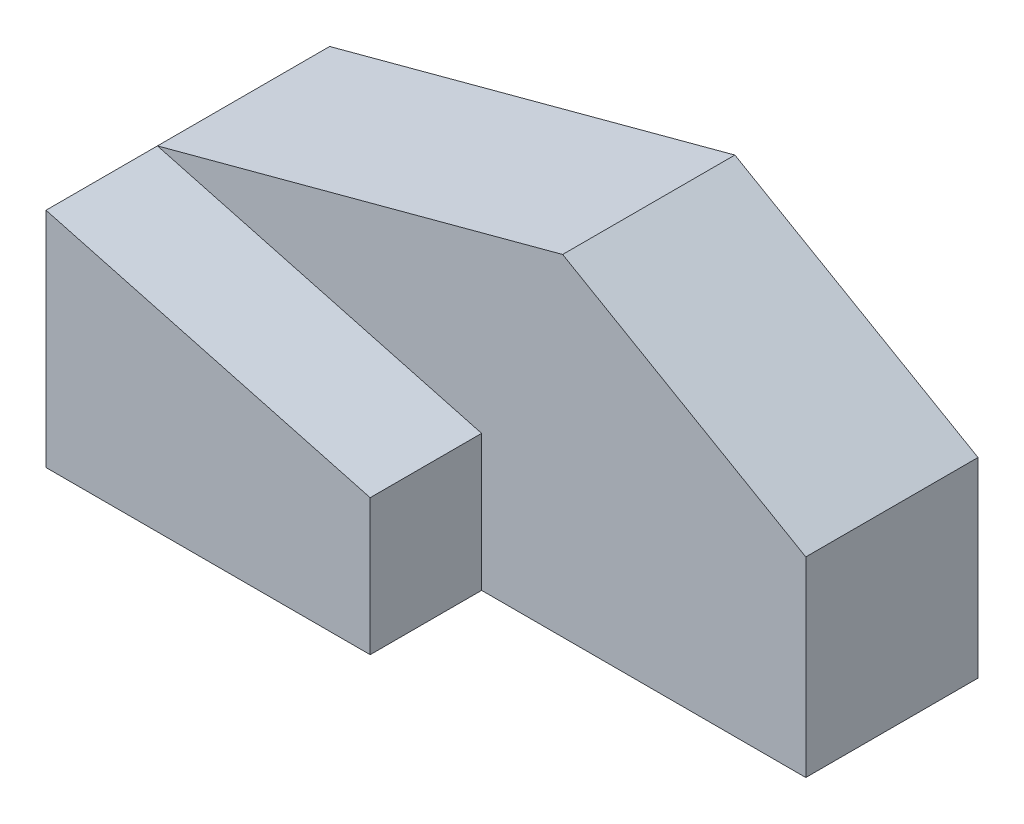
ISO-10303-21;
HEADER;
FILE_DESCRIPTION(('STEP AP214'),'2;1');
FILE_NAME('part.step','',(''),(''),'','','');
FILE_SCHEMA(('AUTOMOTIVE_DESIGN { 1 0 10303 214 1 1 1 1 }'));
ENDSEC;
DATA;
#1=APPLICATION_CONTEXT('core data for automotive mechanical design processes');
#2=APPLICATION_PROTOCOL_DEFINITION('international standard','automotive_design',2000,#1);
#3=PRODUCT_CONTEXT('',#1,'mechanical');
#4=PRODUCT('Part','Part','',(#3));
#5=PRODUCT_RELATED_PRODUCT_CATEGORY('part','',(#4));
#6=PRODUCT_DEFINITION_FORMATION('','',#4);
#7=PRODUCT_DEFINITION_CONTEXT('part definition',#1,'design');
#8=PRODUCT_DEFINITION('design','',#6,#7);
#9=PRODUCT_DEFINITION_SHAPE('','',#8);
#10=(LENGTH_UNIT() NAMED_UNIT(*) SI_UNIT(.MILLI.,.METRE.));
#11=(NAMED_UNIT(*) PLANE_ANGLE_UNIT() SI_UNIT($,.RADIAN.));
#12=(NAMED_UNIT(*) SI_UNIT($,.STERADIAN.) SOLID_ANGLE_UNIT());
#13=UNCERTAINTY_MEASURE_WITH_UNIT(LENGTH_MEASURE(1.E-05),#10,'distance_accuracy_value','');
#14=(GEOMETRIC_REPRESENTATION_CONTEXT(3) GLOBAL_UNCERTAINTY_ASSIGNED_CONTEXT((#13)) GLOBAL_UNIT_ASSIGNED_CONTEXT((#10,
#11,#12)) REPRESENTATION_CONTEXT('',''));
#15=CARTESIAN_POINT('',(0.,0.,0.));
#16=DIRECTION('',(0.,0.,1.));
#17=DIRECTION('',(1.,0.,0.));
#18=AXIS2_PLACEMENT_3D('',#15,#16,#17);
#19=CARTESIAN_POINT('',(0.,22.,-17.));
#20=DIRECTION('',(-1.,0.,0.));
#21=DIRECTION('',(0.,-1.,0.));
#22=AXIS2_PLACEMENT_3D('',#19,#20,#21);
#23=PLANE('',#22);
#24=DIRECTION('',(0.,0.,1.));
#25=VECTOR('',#24,1.);
#26=CARTESIAN_POINT('',(0.,0.,-17.));
#27=LINE('',#26,#25);
#28=CARTESIAN_POINT('',(0.,0.,-17.));
#29=VERTEX_POINT('',#28);
#30=CARTESIAN_POINT('',(0.,0.,11.));
#31=VERTEX_POINT('',#30);
#32=EDGE_CURVE('E82',#29,#31,#27,.T.);
#33=ORIENTED_EDGE('',*,*,#32,.T.);
#34=DIRECTION('',(0.,-1.,0.));
#35=VECTOR('',#34,1.);
#36=CARTESIAN_POINT('',(0.,22.,11.));
#37=LINE('',#36,#35);
#38=CARTESIAN_POINT('',(0.,22.,11.));
#39=VERTEX_POINT('',#38);
#40=EDGE_CURVE('E155',#39,#31,#37,.T.);
#41=ORIENTED_EDGE('',*,*,#40,.F.);
#42=DIRECTION('',(0.,0.,-1.));
#43=VECTOR('',#42,1.);
#44=CARTESIAN_POINT('',(0.,22.,11.));
#45=LINE('',#44,#43);
#46=CARTESIAN_POINT('',(0.,22.,0.));
#47=VERTEX_POINT('',#46);
#48=EDGE_CURVE('E140',#39,#47,#45,.T.);
#49=ORIENTED_EDGE('',*,*,#48,.T.);
#50=DIRECTION('',(0.,0.,1.));
#51=VECTOR('',#50,1.);
#52=CARTESIAN_POINT('',(0.,22.,-17.));
#53=LINE('',#52,#51);
#54=CARTESIAN_POINT('',(0.,22.,-17.));
#55=VERTEX_POINT('',#54);
#56=EDGE_CURVE('E11',#55,#47,#53,.T.);
#57=ORIENTED_EDGE('',*,*,#56,.F.);
#58=DIRECTION('',(0.,-1.,0.));
#59=VECTOR('',#58,1.);
#60=CARTESIAN_POINT('',(0.,22.,-17.));
#61=LINE('',#60,#59);
#62=EDGE_CURVE('E116',#55,#29,#61,.T.);
#63=ORIENTED_EDGE('',*,*,#62,.T.);
#64=EDGE_LOOP('',(#33,#41,#49,#57,#63));
#65=FACE_BOUND('',#64,.T.);
#66=ADVANCED_FACE('F31',(#65),#23,.T.);
#67=CARTESIAN_POINT('',(40.,32.7179676972448,-17.));
#68=DIRECTION('',(-0.258819045102518,0.965925826289069,0.));
#69=DIRECTION('',(-0.965925826289069,-0.258819045102518,0.));
#70=AXIS2_PLACEMENT_3D('',#67,#68,#69);
#71=PLANE('',#70);
#72=DIRECTION('',(-0.965925826289069,-0.258819045102518,0.));
#73=VECTOR('',#72,1.);
#74=CARTESIAN_POINT('',(40.,32.7179676972448,0.));
#75=LINE('',#74,#73);
#76=CARTESIAN_POINT('',(40.,32.7179676972448,0.));
#77=VERTEX_POINT('',#76);
#78=EDGE_CURVE('E149',#77,#47,#75,.T.);
#79=ORIENTED_EDGE('',*,*,#78,.F.);
#80=DIRECTION('',(0.,0.,1.));
#81=VECTOR('',#80,1.);
#82=CARTESIAN_POINT('',(40.,32.7179676972448,-17.));
#83=LINE('',#82,#81);
#84=CARTESIAN_POINT('',(40.,32.7179676972448,-17.));
#85=VERTEX_POINT('',#84);
#86=EDGE_CURVE('E39',#85,#77,#83,.T.);
#87=ORIENTED_EDGE('',*,*,#86,.F.);
#88=DIRECTION('',(-0.965925826289069,-0.258819045102518,0.));
#89=VECTOR('',#88,1.);
#90=CARTESIAN_POINT('',(40.,32.7179676972448,-17.));
#91=LINE('',#90,#89);
#92=EDGE_CURVE('E110',#85,#55,#91,.T.);
#93=ORIENTED_EDGE('',*,*,#92,.T.);
#94=ORIENTED_EDGE('',*,*,#56,.T.);
#95=EDGE_LOOP('',(#79,#87,#93,#94));
#96=FACE_BOUND('',#95,.T.);
#97=ADVANCED_FACE('F187',(#96),#71,.T.);
#98=CARTESIAN_POINT('',(64.,18.8615612366936,-17.));
#99=DIRECTION('',(0.500000000000004,0.866025403784436,0.));
#100=DIRECTION('',(-0.866025403784436,0.500000000000004,0.));
#101=AXIS2_PLACEMENT_3D('',#98,#99,#100);
#102=PLANE('',#101);
#103=DIRECTION('',(-0.866025403784436,0.500000000000004,0.));
#104=VECTOR('',#103,1.);
#105=CARTESIAN_POINT('',(64.,18.8615612366936,0.));
#106=LINE('',#105,#104);
#107=CARTESIAN_POINT('',(64.,18.8615612366936,0.));
#108=VERTEX_POINT('',#107);
#109=EDGE_CURVE('E99',#108,#77,#106,.T.);
#110=ORIENTED_EDGE('',*,*,#109,.F.);
#111=DIRECTION('',(0.,0.,1.));
#112=VECTOR('',#111,1.);
#113=CARTESIAN_POINT('',(64.,18.8615612366936,-17.));
#114=LINE('',#113,#112);
#115=CARTESIAN_POINT('',(64.,18.8615612366936,-17.));
#116=VERTEX_POINT('',#115);
#117=EDGE_CURVE('E93',#116,#108,#114,.T.);
#118=ORIENTED_EDGE('',*,*,#117,.F.);
#119=DIRECTION('',(-0.866025403784436,0.500000000000004,0.));
#120=VECTOR('',#119,1.);
#121=CARTESIAN_POINT('',(64.,18.8615612366936,-17.));
#122=LINE('',#121,#120);
#123=EDGE_CURVE('E96',#116,#85,#122,.T.);
#124=ORIENTED_EDGE('',*,*,#123,.T.);
#125=ORIENTED_EDGE('',*,*,#86,.T.);
#126=EDGE_LOOP('',(#110,#118,#124,#125));
#127=FACE_BOUND('',#126,.T.);
#128=ADVANCED_FACE('F95',(#127),#102,.T.);
#129=CARTESIAN_POINT('',(64.,0.,-17.));
#130=DIRECTION('',(1.,0.,0.));
#131=DIRECTION('',(0.,0.,-1.));
#132=AXIS2_PLACEMENT_3D('',#129,#130,#131);
#133=PLANE('',#132);
#134=DIRECTION('',(0.,1.,0.));
#135=VECTOR('',#134,1.);
#136=CARTESIAN_POINT('',(64.,0.,0.));
#137=LINE('',#136,#135);
#138=CARTESIAN_POINT('',(64.,0.,0.));
#139=VERTEX_POINT('',#138);
#140=EDGE_CURVE('E123',#139,#108,#137,.T.);
#141=ORIENTED_EDGE('',*,*,#140,.F.);
#142=DIRECTION('',(0.,0.,1.));
#143=VECTOR('',#142,1.);
#144=CARTESIAN_POINT('',(64.,0.,-17.));
#145=LINE('',#144,#143);
#146=CARTESIAN_POINT('',(64.,0.,-17.));
#147=VERTEX_POINT('',#146);
#148=EDGE_CURVE('E104',#147,#139,#145,.T.);
#149=ORIENTED_EDGE('',*,*,#148,.F.);
#150=DIRECTION('',(0.,1.,0.));
#151=VECTOR('',#150,1.);
#152=CARTESIAN_POINT('',(64.,0.,-17.));
#153=LINE('',#152,#151);
#154=EDGE_CURVE('E109',#147,#116,#153,.T.);
#155=ORIENTED_EDGE('',*,*,#154,.T.);
#156=ORIENTED_EDGE('',*,*,#117,.T.);
#157=EDGE_LOOP('',(#141,#149,#155,#156));
#158=FACE_BOUND('',#157,.T.);
#159=ADVANCED_FACE('F112',(#158),#133,.T.);
#160=CARTESIAN_POINT('',(0.,0.,-17.));
#161=DIRECTION('',(0.,-1.,0.));
#162=DIRECTION('',(0.,0.,-1.));
#163=AXIS2_PLACEMENT_3D('',#160,#161,#162);
#164=PLANE('',#163);
#165=DIRECTION('',(1.,0.,0.));
#166=VECTOR('',#165,1.);
#167=CARTESIAN_POINT('',(0.,0.,0.));
#168=LINE('',#167,#166);
#169=CARTESIAN_POINT('',(32.,0.,0.));
#170=VERTEX_POINT('',#169);
#171=EDGE_CURVE('E126',#170,#139,#168,.T.);
#172=ORIENTED_EDGE('',*,*,#171,.F.);
#173=DIRECTION('',(0.,0.,-1.));
#174=VECTOR('',#173,1.);
#175=CARTESIAN_POINT('',(32.,0.,11.));
#176=LINE('',#175,#174);
#177=CARTESIAN_POINT('',(32.,0.,11.));
#178=VERTEX_POINT('',#177);
#179=EDGE_CURVE('E129',#178,#170,#176,.T.);
#180=ORIENTED_EDGE('',*,*,#179,.F.);
#181=DIRECTION('',(1.,0.,0.));
#182=VECTOR('',#181,1.);
#183=CARTESIAN_POINT('',(0.,0.,11.));
#184=LINE('',#183,#182);
#185=EDGE_CURVE('E159',#31,#178,#184,.T.);
#186=ORIENTED_EDGE('',*,*,#185,.F.);
#187=ORIENTED_EDGE('',*,*,#32,.F.);
#188=DIRECTION('',(1.,0.,0.));
#189=VECTOR('',#188,1.);
#190=CARTESIAN_POINT('',(0.,0.,-17.));
#191=LINE('',#190,#189);
#192=EDGE_CURVE('E114',#29,#147,#191,.T.);
#193=ORIENTED_EDGE('',*,*,#192,.T.);
#194=ORIENTED_EDGE('',*,*,#148,.T.);
#195=EDGE_LOOP('',(#172,#180,#186,#187,#193,#194));
#196=FACE_BOUND('',#195,.T.);
#197=ADVANCED_FACE('F160',(#196),#164,.T.);
#198=CARTESIAN_POINT('',(0.,0.,-17.));
#199=DIRECTION('',(0.,0.,1.));
#200=DIRECTION('',(1.,0.,0.));
#201=AXIS2_PLACEMENT_3D('',#198,#199,#200);
#202=PLANE('',#201);
#203=ORIENTED_EDGE('',*,*,#62,.F.);
#204=ORIENTED_EDGE('',*,*,#92,.F.);
#205=ORIENTED_EDGE('',*,*,#123,.F.);
#206=ORIENTED_EDGE('',*,*,#154,.F.);
#207=ORIENTED_EDGE('',*,*,#192,.F.);
#208=EDGE_LOOP('',(#203,#204,#205,#206,#207));
#209=FACE_BOUND('',#208,.T.);
#210=ADVANCED_FACE('F108',(#209),#202,.F.);
#211=CARTESIAN_POINT('',(0.,0.,0.));
#212=DIRECTION('',(0.,0.,1.));
#213=DIRECTION('',(1.,0.,0.));
#214=AXIS2_PLACEMENT_3D('',#211,#212,#213);
#215=PLANE('',#214);
#216=DIRECTION('',(-0.965925826289067,0.258819045102525,0.));
#217=VECTOR('',#216,1.);
#218=CARTESIAN_POINT('',(32.,13.4256258422039,0.));
#219=LINE('',#218,#217);
#220=CARTESIAN_POINT('',(32.,13.4256258422039,0.));
#221=VERTEX_POINT('',#220);
#222=EDGE_CURVE('E132',#221,#47,#219,.T.);
#223=ORIENTED_EDGE('',*,*,#222,.F.);
#224=DIRECTION('',(0.,1.,0.));
#225=VECTOR('',#224,1.);
#226=CARTESIAN_POINT('',(32.,0.,0.));
#227=LINE('',#226,#225);
#228=EDGE_CURVE('E47',#170,#221,#227,.T.);
#229=ORIENTED_EDGE('',*,*,#228,.F.);
#230=ORIENTED_EDGE('',*,*,#171,.T.);
#231=ORIENTED_EDGE('',*,*,#140,.T.);
#232=ORIENTED_EDGE('',*,*,#109,.T.);
#233=ORIENTED_EDGE('',*,*,#78,.T.);
#234=EDGE_LOOP('',(#223,#229,#230,#231,#232,#233));
#235=FACE_BOUND('',#234,.T.);
#236=ADVANCED_FACE('F176',(#235),#215,.T.);
#237=CARTESIAN_POINT('',(32.,0.,11.));
#238=DIRECTION('',(-1.,0.,0.));
#239=DIRECTION('',(0.,0.,1.));
#240=AXIS2_PLACEMENT_3D('',#237,#238,#239);
#241=PLANE('',#240);
#242=ORIENTED_EDGE('',*,*,#228,.T.);
#243=DIRECTION('',(0.,0.,-1.));
#244=VECTOR('',#243,1.);
#245=CARTESIAN_POINT('',(32.,13.4256258422039,11.));
#246=LINE('',#245,#244);
#247=CARTESIAN_POINT('',(32.,13.4256258422039,11.));
#248=VERTEX_POINT('',#247);
#249=EDGE_CURVE('E135',#248,#221,#246,.T.);
#250=ORIENTED_EDGE('',*,*,#249,.F.);
#251=DIRECTION('',(0.,1.,0.));
#252=VECTOR('',#251,1.);
#253=CARTESIAN_POINT('',(32.,0.,11.));
#254=LINE('',#253,#252);
#255=EDGE_CURVE('E163',#178,#248,#254,.T.);
#256=ORIENTED_EDGE('',*,*,#255,.F.);
#257=ORIENTED_EDGE('',*,*,#179,.T.);
#258=EDGE_LOOP('',(#242,#250,#256,#257));
#259=FACE_BOUND('',#258,.T.);
#260=ADVANCED_FACE('F173',(#259),#241,.F.);
#261=CARTESIAN_POINT('',(32.,13.4256258422039,11.));
#262=DIRECTION('',(-0.258819045102525,-0.965925826289067,0.));
#263=DIRECTION('',(0.965925826289067,-0.258819045102525,0.));
#264=AXIS2_PLACEMENT_3D('',#261,#262,#263);
#265=PLANE('',#264);
#266=ORIENTED_EDGE('',*,*,#222,.T.);
#267=ORIENTED_EDGE('',*,*,#48,.F.);
#268=DIRECTION('',(-0.965925826289067,0.258819045102525,0.));
#269=VECTOR('',#268,1.);
#270=CARTESIAN_POINT('',(32.,13.4256258422039,11.));
#271=LINE('',#270,#269);
#272=EDGE_CURVE('E146',#248,#39,#271,.T.);
#273=ORIENTED_EDGE('',*,*,#272,.F.);
#274=ORIENTED_EDGE('',*,*,#249,.T.);
#275=EDGE_LOOP('',(#266,#267,#273,#274));
#276=FACE_BOUND('',#275,.T.);
#277=ADVANCED_FACE('F174',(#276),#265,.F.);
#278=CARTESIAN_POINT('',(0.,0.,11.));
#279=DIRECTION('',(0.,0.,1.));
#280=DIRECTION('',(1.,0.,0.));
#281=AXIS2_PLACEMENT_3D('',#278,#279,#280);
#282=PLANE('',#281);
#283=ORIENTED_EDGE('',*,*,#40,.T.);
#284=ORIENTED_EDGE('',*,*,#185,.T.);
#285=ORIENTED_EDGE('',*,*,#255,.T.);
#286=ORIENTED_EDGE('',*,*,#272,.T.);
#287=EDGE_LOOP('',(#283,#284,#285,#286));
#288=FACE_BOUND('',#287,.T.);
#289=ADVANCED_FACE('F166',(#288),#282,.T.);
#290=CLOSED_SHELL('',(#66,#97,#128,#159,#197,#210,#236,#260,#277,#289));
#291=MANIFOLD_SOLID_BREP('B2',#290);
#292=ADVANCED_BREP_SHAPE_REPRESENTATION('',(#18,#291),#14);
#293=SHAPE_DEFINITION_REPRESENTATION(#9,#292);
ENDSEC;
END-ISO-10303-21;
